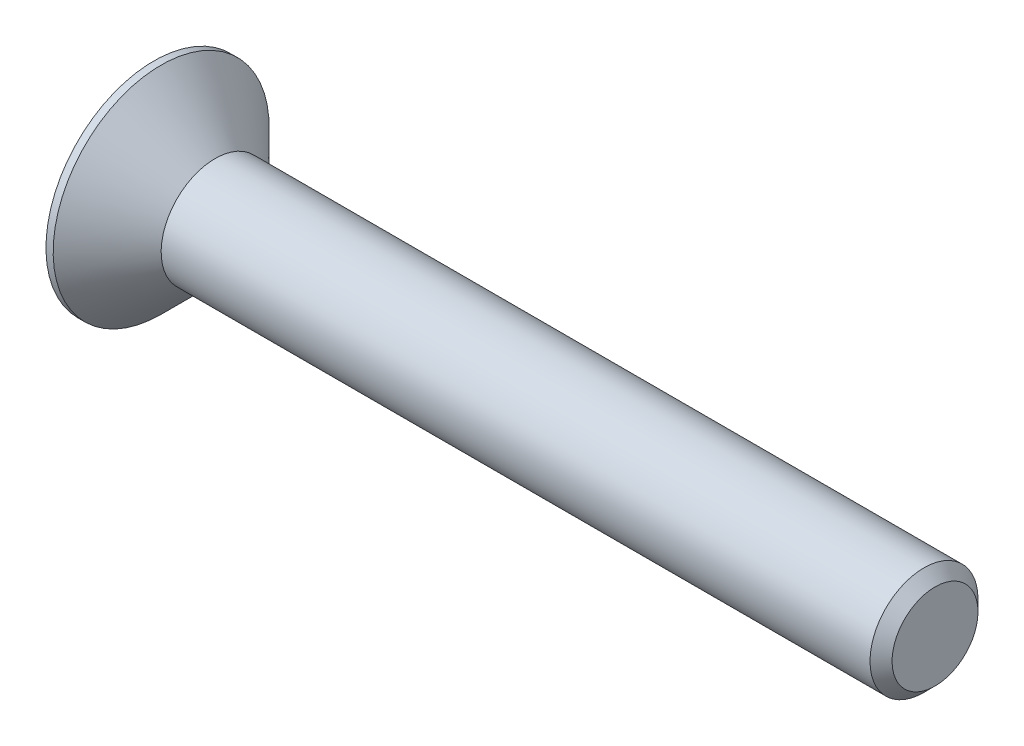
ISO-10303-21;
HEADER;
FILE_DESCRIPTION(('STEP AP214'),'2;1');
FILE_NAME('part.step','',(''),(''),'','','');
FILE_SCHEMA(('AUTOMOTIVE_DESIGN { 1 0 10303 214 1 1 1 1 }'));
ENDSEC;
DATA;
#1=APPLICATION_CONTEXT('core data for automotive mechanical design processes');
#2=APPLICATION_PROTOCOL_DEFINITION('international standard','automotive_design',2000,#1);
#3=PRODUCT_CONTEXT('',#1,'mechanical');
#4=PRODUCT('Part','Part','',(#3));
#5=PRODUCT_RELATED_PRODUCT_CATEGORY('part','',(#4));
#6=PRODUCT_DEFINITION_FORMATION('','',#4);
#7=PRODUCT_DEFINITION_CONTEXT('part definition',#1,'design');
#8=PRODUCT_DEFINITION('design','',#6,#7);
#9=PRODUCT_DEFINITION_SHAPE('','',#8);
#10=(LENGTH_UNIT() NAMED_UNIT(*) SI_UNIT(.MILLI.,.METRE.));
#11=(NAMED_UNIT(*) PLANE_ANGLE_UNIT() SI_UNIT($,.RADIAN.));
#12=(NAMED_UNIT(*) SI_UNIT($,.STERADIAN.) SOLID_ANGLE_UNIT());
#13=UNCERTAINTY_MEASURE_WITH_UNIT(LENGTH_MEASURE(1.E-05),#10,'distance_accuracy_value','');
#14=(GEOMETRIC_REPRESENTATION_CONTEXT(3) GLOBAL_UNCERTAINTY_ASSIGNED_CONTEXT((#13)) GLOBAL_UNIT_ASSIGNED_CONTEXT((#10,
#11,#12)) REPRESENTATION_CONTEXT('',''));
#15=CARTESIAN_POINT('',(0.,0.,0.));
#16=DIRECTION('',(0.,0.,1.));
#17=DIRECTION('',(1.,0.,0.));
#18=AXIS2_PLACEMENT_3D('',#15,#16,#17);
#19=CARTESIAN_POINT('',(0.,-1.,0.5773502691896));
#20=DIRECTION('',(0.,-0.500000000000017,0.866025403784429));
#21=DIRECTION('',(0.,-0.866025403784429,-0.500000000000017));
#22=AXIS2_PLACEMENT_3D('',#19,#20,#21);
#23=PLANE('',#22);
#24=DIRECTION('',(-1.,0.,0.));
#25=VECTOR('',#24,1.);
#26=CARTESIAN_POINT('',(0.7,-1.,0.5773502691896));
#27=LINE('',#26,#25);
#28=CARTESIAN_POINT('',(0.7,-1.,0.5773502691896));
#29=VERTEX_POINT('',#28);
#30=CARTESIAN_POINT('',(0.,-1.,0.5773502691896));
#31=VERTEX_POINT('',#30);
#32=EDGE_CURVE('E11',#29,#31,#27,.T.);
#33=ORIENTED_EDGE('',*,*,#32,.T.);
#34=DIRECTION('',(0.,-0.866025403784429,-0.500000000000017));
#35=VECTOR('',#34,1.);
#36=CARTESIAN_POINT('',(0.,0.,1.154700538379));
#37=LINE('',#36,#35);
#38=CARTESIAN_POINT('',(0.,0.,1.154700538379));
#39=VERTEX_POINT('',#38);
#40=EDGE_CURVE('E36',#39,#31,#37,.T.);
#41=ORIENTED_EDGE('',*,*,#40,.F.);
#42=DIRECTION('',(-1.,0.,0.));
#43=VECTOR('',#42,1.);
#44=CARTESIAN_POINT('',(0.7,0.,1.154700538379));
#45=LINE('',#44,#43);
#46=CARTESIAN_POINT('',(0.7,0.,1.154700538379));
#47=VERTEX_POINT('',#46);
#48=EDGE_CURVE('E82',#47,#39,#45,.T.);
#49=ORIENTED_EDGE('',*,*,#48,.F.);
#50=DIRECTION('',(0.,0.866025403784429,0.500000000000017));
#51=VECTOR('',#50,1.);
#52=CARTESIAN_POINT('',(0.7,-1.,0.5773502691896));
#53=LINE('',#52,#51);
#54=EDGE_CURVE('E263',#29,#47,#53,.T.);
#55=ORIENTED_EDGE('',*,*,#54,.F.);
#56=EDGE_LOOP('',(#33,#41,#49,#55));
#57=FACE_BOUND('',#56,.T.);
#58=ADVANCED_FACE('F17',(#57),#23,.F.);
#59=CARTESIAN_POINT('',(0.7,0.,0.));
#60=DIRECTION('',(-1.,0.,0.));
#61=DIRECTION('',(0.,0.,1.));
#62=AXIS2_PLACEMENT_3D('',#59,#60,#61);
#63=PLANE('',#62);
#64=DIRECTION('',(0.,0.866025403784429,-0.500000000000017));
#65=VECTOR('',#64,1.);
#66=CARTESIAN_POINT('',(0.7,0.,1.154700538379));
#67=LINE('',#66,#65);
#68=CARTESIAN_POINT('',(0.7,1.,0.5773502691896));
#69=VERTEX_POINT('',#68);
#70=EDGE_CURVE('E27',#47,#69,#67,.T.);
#71=ORIENTED_EDGE('',*,*,#70,.T.);
#72=DIRECTION('',(0.,0.,1.));
#73=VECTOR('',#72,1.);
#74=CARTESIAN_POINT('',(0.7,1.,-0.5773502691896));
#75=LINE('',#74,#73);
#76=CARTESIAN_POINT('',(0.7,1.,-0.5773502691896));
#77=VERTEX_POINT('',#76);
#78=EDGE_CURVE('E76',#77,#69,#75,.T.);
#79=ORIENTED_EDGE('',*,*,#78,.F.);
#80=DIRECTION('',(0.,-0.866025403784429,-0.500000000000017));
#81=VECTOR('',#80,1.);
#82=CARTESIAN_POINT('',(0.7,1.,-0.5773502691896));
#83=LINE('',#82,#81);
#84=CARTESIAN_POINT('',(0.7,0.,-1.154700538379));
#85=VERTEX_POINT('',#84);
#86=EDGE_CURVE('E105',#77,#85,#83,.T.);
#87=ORIENTED_EDGE('',*,*,#86,.T.);
#88=DIRECTION('',(0.,-0.866025403784429,0.500000000000017));
#89=VECTOR('',#88,1.);
#90=CARTESIAN_POINT('',(0.7,0.,-1.154700538379));
#91=LINE('',#90,#89);
#92=CARTESIAN_POINT('',(0.7,-1.,-0.5773502691896));
#93=VERTEX_POINT('',#92);
#94=EDGE_CURVE('E102',#85,#93,#91,.T.);
#95=ORIENTED_EDGE('',*,*,#94,.T.);
#96=DIRECTION('',(0.,0.,-1.));
#97=VECTOR('',#96,1.);
#98=CARTESIAN_POINT('',(0.7,-1.,0.5773502691896));
#99=LINE('',#98,#97);
#100=EDGE_CURVE('E113',#29,#93,#99,.T.);
#101=ORIENTED_EDGE('',*,*,#100,.F.);
#102=ORIENTED_EDGE('',*,*,#54,.T.);
#103=EDGE_LOOP('',(#71,#79,#87,#95,#101,#102));
#104=FACE_BOUND('',#103,.T.);
#105=ADVANCED_FACE('F145',(#104),#63,.T.);
#106=CARTESIAN_POINT('',(0.,-1.,-0.5773502691896));
#107=DIRECTION('',(0.,-1.,0.));
#108=DIRECTION('',(0.,0.,-1.));
#109=AXIS2_PLACEMENT_3D('',#106,#107,#108);
#110=PLANE('',#109);
#111=DIRECTION('',(-1.,0.,0.));
#112=VECTOR('',#111,1.);
#113=CARTESIAN_POINT('',(0.7,-1.,-0.5773502691896));
#114=LINE('',#113,#112);
#115=CARTESIAN_POINT('',(0.,-1.,-0.5773502691896));
#116=VERTEX_POINT('',#115);
#117=EDGE_CURVE('E260',#93,#116,#114,.T.);
#118=ORIENTED_EDGE('',*,*,#117,.T.);
#119=DIRECTION('',(0.,0.,1.));
#120=VECTOR('',#119,1.);
#121=CARTESIAN_POINT('',(0.,-1.,-0.5773502691896));
#122=LINE('',#121,#120);
#123=EDGE_CURVE('E108',#116,#31,#122,.T.);
#124=ORIENTED_EDGE('',*,*,#123,.T.);
#125=ORIENTED_EDGE('',*,*,#32,.F.);
#126=ORIENTED_EDGE('',*,*,#100,.T.);
#127=EDGE_LOOP('',(#118,#124,#125,#126));
#128=FACE_BOUND('',#127,.T.);
#129=ADVANCED_FACE('F151',(#128),#110,.F.);
#130=CARTESIAN_POINT('',(0.,1.5,0.));
#131=DIRECTION('',(-1.,0.,0.));
#132=DIRECTION('',(0.,1.,0.));
#133=AXIS2_PLACEMENT_3D('',#130,#131,#132);
#134=PLANE('',#133);
#135=CARTESIAN_POINT('',(0.,0.,0.));
#136=DIRECTION('',(-1.,0.,0.));
#137=DIRECTION('',(0.,-1.,0.));
#138=AXIS2_PLACEMENT_3D('',#135,#136,#137);
#139=CIRCLE('',#138,3.);
#140=CARTESIAN_POINT('',(0.,-3.,0.));
#141=VERTEX_POINT('',#140);
#142=EDGE_CURVE('E110',#141,#141,#139,.T.);
#143=ORIENTED_EDGE('',*,*,#142,.T.);
#144=EDGE_LOOP('',(#143));
#145=FACE_BOUND('',#144,.T.);
#146=ORIENTED_EDGE('',*,*,#123,.F.);
#147=DIRECTION('',(0.,0.866025403784429,-0.500000000000017));
#148=VECTOR('',#147,1.);
#149=CARTESIAN_POINT('',(0.,-1.,-0.5773502691896));
#150=LINE('',#149,#148);
#151=CARTESIAN_POINT('',(0.,0.,-1.154700538379));
#152=VERTEX_POINT('',#151);
#153=EDGE_CURVE('E100',#116,#152,#150,.T.);
#154=ORIENTED_EDGE('',*,*,#153,.T.);
#155=DIRECTION('',(0.,0.866025403784429,0.500000000000017));
#156=VECTOR('',#155,1.);
#157=CARTESIAN_POINT('',(0.,0.,-1.154700538379));
#158=LINE('',#157,#156);
#159=CARTESIAN_POINT('',(0.,1.,-0.5773502691896));
#160=VERTEX_POINT('',#159);
#161=EDGE_CURVE('E73',#152,#160,#158,.T.);
#162=ORIENTED_EDGE('',*,*,#161,.T.);
#163=DIRECTION('',(0.,0.,-1.));
#164=VECTOR('',#163,1.);
#165=CARTESIAN_POINT('',(0.,1.,0.5773502691896));
#166=LINE('',#165,#164);
#167=CARTESIAN_POINT('',(0.,1.,0.5773502691896));
#168=VERTEX_POINT('',#167);
#169=EDGE_CURVE('E67',#168,#160,#166,.T.);
#170=ORIENTED_EDGE('',*,*,#169,.F.);
#171=DIRECTION('',(0.,-0.866025403784429,0.500000000000017));
#172=VECTOR('',#171,1.);
#173=CARTESIAN_POINT('',(0.,1.,0.5773502691896));
#174=LINE('',#173,#172);
#175=EDGE_CURVE('E71',#168,#39,#174,.T.);
#176=ORIENTED_EDGE('',*,*,#175,.T.);
#177=ORIENTED_EDGE('',*,*,#40,.T.);
#178=EDGE_LOOP('',(#146,#154,#162,#170,#176,#177));
#179=FACE_BOUND('',#178,.T.);
#180=ADVANCED_FACE('F70',(#145,#179),#134,.T.);
#181=CARTESIAN_POINT('',(0.1,0.,0.));
#182=DIRECTION('',(1.,0.,0.));
#183=DIRECTION('',(0.,1.,0.));
#184=AXIS2_PLACEMENT_3D('',#181,#182,#183);
#185=CYLINDRICAL_SURFACE('',#184,3.);
#186=CARTESIAN_POINT('',(0.2,0.,0.));
#187=DIRECTION('',(1.,0.,0.));
#188=DIRECTION('',(0.,-1.,0.));
#189=AXIS2_PLACEMENT_3D('',#186,#187,#188);
#190=CIRCLE('',#189,3.);
#191=CARTESIAN_POINT('',(0.2,-3.,0.));
#192=VERTEX_POINT('',#191);
#193=EDGE_CURVE('E117',#192,#192,#190,.T.);
#194=ORIENTED_EDGE('',*,*,#193,.F.);
#195=EDGE_LOOP('',(#194));
#196=FACE_BOUND('',#195,.T.);
#197=ORIENTED_EDGE('',*,*,#142,.F.);
#198=EDGE_LOOP('',(#197));
#199=FACE_BOUND('',#198,.T.);
#200=ADVANCED_FACE('F160',(#196,#199),#185,.T.);
#201=CARTESIAN_POINT('',(0.95,0.,0.));
#202=DIRECTION('',(-1.,0.,0.));
#203=DIRECTION('',(0.,1.,0.));
#204=AXIS2_PLACEMENT_3D('',#201,#202,#203);
#205=CONICAL_SURFACE('',#204,2.25,0.7853981633973);
#206=CARTESIAN_POINT('',(1.7,0.,0.));
#207=DIRECTION('',(-1.,0.,0.));
#208=DIRECTION('',(0.,-1.,0.));
#209=AXIS2_PLACEMENT_3D('',#206,#207,#208);
#210=CIRCLE('',#209,1.5);
#211=CARTESIAN_POINT('',(1.7,-1.5,0.));
#212=VERTEX_POINT('',#211);
#213=EDGE_CURVE('E120',#212,#212,#210,.T.);
#214=ORIENTED_EDGE('',*,*,#213,.T.);
#215=EDGE_LOOP('',(#214));
#216=FACE_BOUND('',#215,.T.);
#217=ORIENTED_EDGE('',*,*,#193,.T.);
#218=EDGE_LOOP('',(#217));
#219=FACE_BOUND('',#218,.T.);
#220=ADVANCED_FACE('F141',(#216,#219),#205,.T.);
#221=CARTESIAN_POINT('',(11.54675,0.,0.));
#222=DIRECTION('',(1.,0.,0.));
#223=DIRECTION('',(0.,1.,0.));
#224=AXIS2_PLACEMENT_3D('',#221,#222,#223);
#225=CYLINDRICAL_SURFACE('',#224,1.5);
#226=CARTESIAN_POINT('',(21.3935,0.,0.));
#227=DIRECTION('',(1.,0.,0.));
#228=DIRECTION('',(0.,-1.,0.));
#229=AXIS2_PLACEMENT_3D('',#226,#227,#228);
#230=CIRCLE('',#229,1.5);
#231=CARTESIAN_POINT('',(21.3935,-1.5,0.));
#232=VERTEX_POINT('',#231);
#233=EDGE_CURVE('E121',#232,#232,#230,.T.);
#234=ORIENTED_EDGE('',*,*,#233,.F.);
#235=EDGE_LOOP('',(#234));
#236=FACE_BOUND('',#235,.T.);
#237=ORIENTED_EDGE('',*,*,#213,.F.);
#238=EDGE_LOOP('',(#237));
#239=FACE_BOUND('',#238,.T.);
#240=ADVANCED_FACE('F133',(#236,#239),#225,.T.);
#241=CARTESIAN_POINT('',(21.54675,0.,0.));
#242=DIRECTION('',(-1.,0.,0.));
#243=DIRECTION('',(0.,1.,0.));
#244=AXIS2_PLACEMENT_3D('',#241,#242,#243);
#245=CONICAL_SURFACE('',#244,1.34675,0.7853981633973);
#246=CARTESIAN_POINT('',(21.7,0.,0.));
#247=DIRECTION('',(1.,0.,0.));
#248=DIRECTION('',(0.,1.,0.));
#249=AXIS2_PLACEMENT_3D('',#246,#247,#248);
#250=CIRCLE('',#249,1.1935);
#251=CARTESIAN_POINT('',(21.7,1.1935,0.));
#252=VERTEX_POINT('',#251);
#253=EDGE_CURVE('E87',#252,#252,#250,.T.);
#254=ORIENTED_EDGE('',*,*,#253,.F.);
#255=EDGE_LOOP('',(#254));
#256=FACE_BOUND('',#255,.T.);
#257=ORIENTED_EDGE('',*,*,#233,.T.);
#258=EDGE_LOOP('',(#257));
#259=FACE_BOUND('',#258,.T.);
#260=ADVANCED_FACE('F131',(#256,#259),#245,.T.);
#261=CARTESIAN_POINT('',(21.7,0.59675,0.));
#262=DIRECTION('',(1.,0.,0.));
#263=DIRECTION('',(0.,-1.,0.));
#264=AXIS2_PLACEMENT_3D('',#261,#262,#263);
#265=PLANE('',#264);
#266=ORIENTED_EDGE('',*,*,#253,.T.);
#267=EDGE_LOOP('',(#266));
#268=FACE_BOUND('',#267,.T.);
#269=ADVANCED_FACE('F129',(#268),#265,.T.);
#270=CARTESIAN_POINT('',(0.,0.,1.154700538379));
#271=DIRECTION('',(0.,0.500000000000017,0.866025403784429));
#272=DIRECTION('',(0.,-0.866025403784429,0.500000000000017));
#273=AXIS2_PLACEMENT_3D('',#270,#271,#272);
#274=PLANE('',#273);
#275=ORIENTED_EDGE('',*,*,#48,.T.);
#276=ORIENTED_EDGE('',*,*,#175,.F.);
#277=DIRECTION('',(-1.,0.,0.));
#278=VECTOR('',#277,1.);
#279=CARTESIAN_POINT('',(0.7,1.,0.5773502691896));
#280=LINE('',#279,#278);
#281=EDGE_CURVE('E75',#69,#168,#280,.T.);
#282=ORIENTED_EDGE('',*,*,#281,.F.);
#283=ORIENTED_EDGE('',*,*,#70,.F.);
#284=EDGE_LOOP('',(#275,#276,#282,#283));
#285=FACE_BOUND('',#284,.T.);
#286=ADVANCED_FACE('F80',(#285),#274,.F.);
#287=CARTESIAN_POINT('',(0.,1.,0.5773502691896));
#288=DIRECTION('',(0.,1.,0.));
#289=DIRECTION('',(0.,0.,1.));
#290=AXIS2_PLACEMENT_3D('',#287,#288,#289);
#291=PLANE('',#290);
#292=ORIENTED_EDGE('',*,*,#281,.T.);
#293=ORIENTED_EDGE('',*,*,#169,.T.);
#294=DIRECTION('',(-1.,0.,0.));
#295=VECTOR('',#294,1.);
#296=CARTESIAN_POINT('',(0.7,1.,-0.5773502691896));
#297=LINE('',#296,#295);
#298=EDGE_CURVE('E91',#77,#160,#297,.T.);
#299=ORIENTED_EDGE('',*,*,#298,.F.);
#300=ORIENTED_EDGE('',*,*,#78,.T.);
#301=EDGE_LOOP('',(#292,#293,#299,#300));
#302=FACE_BOUND('',#301,.T.);
#303=ADVANCED_FACE('F84',(#302),#291,.F.);
#304=CARTESIAN_POINT('',(0.,1.,-0.5773502691896));
#305=DIRECTION('',(0.,0.500000000000017,-0.866025403784429));
#306=DIRECTION('',(0.,0.866025403784429,0.500000000000017));
#307=AXIS2_PLACEMENT_3D('',#304,#305,#306);
#308=PLANE('',#307);
#309=ORIENTED_EDGE('',*,*,#298,.T.);
#310=ORIENTED_EDGE('',*,*,#161,.F.);
#311=DIRECTION('',(-1.,0.,0.));
#312=VECTOR('',#311,1.);
#313=CARTESIAN_POINT('',(0.7,0.,-1.154700538379));
#314=LINE('',#313,#312);
#315=EDGE_CURVE('E21',#85,#152,#314,.T.);
#316=ORIENTED_EDGE('',*,*,#315,.F.);
#317=ORIENTED_EDGE('',*,*,#86,.F.);
#318=EDGE_LOOP('',(#309,#310,#316,#317));
#319=FACE_BOUND('',#318,.T.);
#320=ADVANCED_FACE('F104',(#319),#308,.F.);
#321=CARTESIAN_POINT('',(0.,0.,-1.154700538379));
#322=DIRECTION('',(0.,-0.500000000000017,-0.866025403784429));
#323=DIRECTION('',(0.,0.866025403784429,-0.500000000000017));
#324=AXIS2_PLACEMENT_3D('',#321,#322,#323);
#325=PLANE('',#324);
#326=ORIENTED_EDGE('',*,*,#315,.T.);
#327=ORIENTED_EDGE('',*,*,#153,.F.);
#328=ORIENTED_EDGE('',*,*,#117,.F.);
#329=ORIENTED_EDGE('',*,*,#94,.F.);
#330=EDGE_LOOP('',(#326,#327,#328,#329));
#331=FACE_BOUND('',#330,.T.);
#332=ADVANCED_FACE('F19',(#331),#325,.F.);
#333=CLOSED_SHELL('',(#58,#105,#129,#180,#200,#220,#240,#260,#269,#286,#303,#320,#332));
#334=MANIFOLD_SOLID_BREP('B1',#333);
#335=ADVANCED_BREP_SHAPE_REPRESENTATION('',(#18,#334),#14);
#336=SHAPE_DEFINITION_REPRESENTATION(#9,#335);
ENDSEC;
END-ISO-10303-21;
